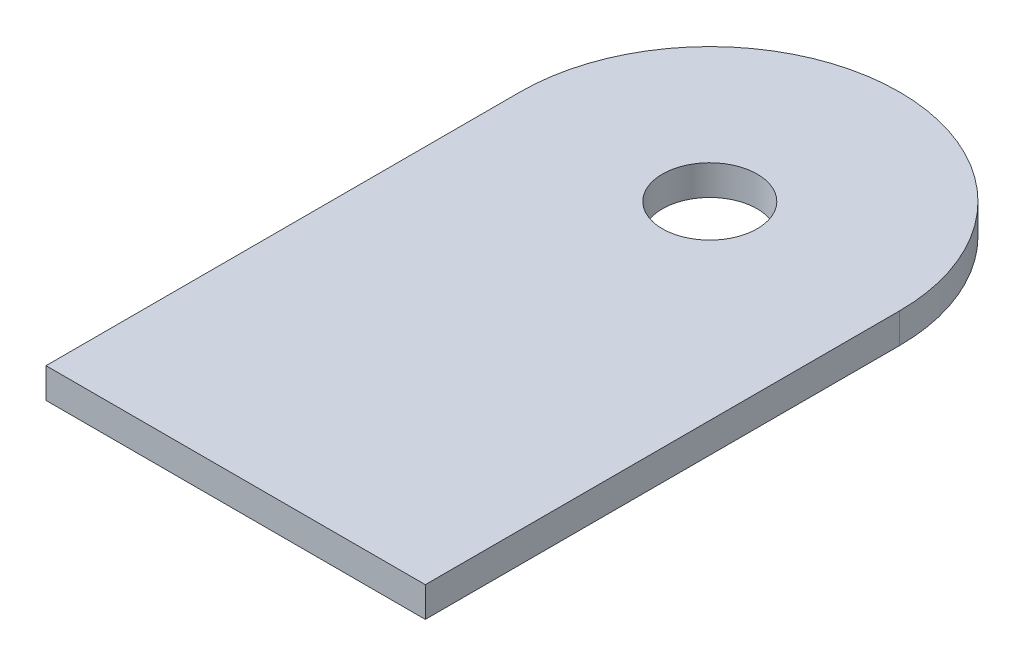
ISO-10303-21;
HEADER;
FILE_DESCRIPTION(('STEP AP214'),'2;1');
FILE_NAME('part.step','',(''),(''),'','','');
FILE_SCHEMA(('AUTOMOTIVE_DESIGN { 1 0 10303 214 1 1 1 1 }'));
ENDSEC;
DATA;
#1=APPLICATION_CONTEXT('core data for automotive mechanical design processes');
#2=APPLICATION_PROTOCOL_DEFINITION('international standard','automotive_design',2000,#1);
#3=PRODUCT_CONTEXT('',#1,'mechanical');
#4=PRODUCT('Part','Part','',(#3));
#5=PRODUCT_RELATED_PRODUCT_CATEGORY('part','',(#4));
#6=PRODUCT_DEFINITION_FORMATION('','',#4);
#7=PRODUCT_DEFINITION_CONTEXT('part definition',#1,'design');
#8=PRODUCT_DEFINITION('design','',#6,#7);
#9=PRODUCT_DEFINITION_SHAPE('','',#8);
#10=(LENGTH_UNIT() NAMED_UNIT(*) SI_UNIT(.MILLI.,.METRE.));
#11=(NAMED_UNIT(*) PLANE_ANGLE_UNIT() SI_UNIT($,.RADIAN.));
#12=(NAMED_UNIT(*) SI_UNIT($,.STERADIAN.) SOLID_ANGLE_UNIT());
#13=UNCERTAINTY_MEASURE_WITH_UNIT(LENGTH_MEASURE(1.E-05),#10,'distance_accuracy_value','');
#14=(GEOMETRIC_REPRESENTATION_CONTEXT(3) GLOBAL_UNCERTAINTY_ASSIGNED_CONTEXT((#13)) GLOBAL_UNIT_ASSIGNED_CONTEXT((#10,
#11,#12)) REPRESENTATION_CONTEXT('',''));
#15=CARTESIAN_POINT('',(0.,0.,0.));
#16=DIRECTION('',(0.,0.,1.));
#17=DIRECTION('',(1.,0.,0.));
#18=AXIS2_PLACEMENT_3D('',#15,#16,#17);
#19=CARTESIAN_POINT('',(0.,1.5875,0.));
#20=DIRECTION('',(0.,-1.,0.));
#21=DIRECTION('',(0.,0.,-1.));
#22=AXIS2_PLACEMENT_3D('',#19,#20,#21);
#23=PLANE('',#22);
#24=CARTESIAN_POINT('',(0.,1.5875,0.));
#25=DIRECTION('',(0.,1.,0.));
#26=DIRECTION('',(0.,0.,-1.));
#27=AXIS2_PLACEMENT_3D('',#24,#25,#26);
#28=CIRCLE('',#27,10.);
#29=CARTESIAN_POINT('',(10.,1.5875,0.));
#30=VERTEX_POINT('',#29);
#31=CARTESIAN_POINT('',(-10.,1.5875,0.));
#32=VERTEX_POINT('',#31);
#33=EDGE_CURVE('E88',#30,#32,#28,.T.);
#34=ORIENTED_EDGE('',*,*,#33,.T.);
#35=DIRECTION('',(0.,0.,1.));
#36=VECTOR('',#35,1.);
#37=CARTESIAN_POINT('',(-10.,1.5875,25.));
#38=LINE('',#37,#36);
#39=CARTESIAN_POINT('',(-10.,1.5875,25.));
#40=VERTEX_POINT('',#39);
#41=EDGE_CURVE('E83',#32,#40,#38,.T.);
#42=ORIENTED_EDGE('',*,*,#41,.T.);
#43=DIRECTION('',(1.,0.,0.));
#44=VECTOR('',#43,1.);
#45=CARTESIAN_POINT('',(10.,1.5875,25.));
#46=LINE('',#45,#44);
#47=CARTESIAN_POINT('',(10.,1.5875,25.));
#48=VERTEX_POINT('',#47);
#49=EDGE_CURVE('E86',#40,#48,#46,.T.);
#50=ORIENTED_EDGE('',*,*,#49,.T.);
#51=DIRECTION('',(0.,0.,-1.));
#52=VECTOR('',#51,1.);
#53=CARTESIAN_POINT('',(10.,1.5875,0.));
#54=LINE('',#53,#52);
#55=EDGE_CURVE('E53',#48,#30,#54,.T.);
#56=ORIENTED_EDGE('',*,*,#55,.T.);
#57=EDGE_LOOP('',(#34,#42,#50,#56));
#58=FACE_BOUND('',#57,.T.);
#59=CARTESIAN_POINT('',(0.,1.5875,0.));
#60=DIRECTION('',(0.,1.,0.));
#61=DIRECTION('',(0.,0.,1.));
#62=AXIS2_PLACEMENT_3D('',#59,#60,#61);
#63=CIRCLE('',#62,2.5);
#64=CARTESIAN_POINT('',(0.,1.5875,2.5));
#65=VERTEX_POINT('',#64);
#66=EDGE_CURVE('E103',#65,#65,#63,.T.);
#67=ORIENTED_EDGE('',*,*,#66,.F.);
#68=EDGE_LOOP('',(#67));
#69=FACE_BOUND('',#68,.T.);
#70=ADVANCED_FACE('F36',(#58,#69),#23,.F.);
#71=CARTESIAN_POINT('',(0.,0.,0.));
#72=DIRECTION('',(0.,-1.,0.));
#73=DIRECTION('',(0.,0.,-1.));
#74=AXIS2_PLACEMENT_3D('',#71,#72,#73);
#75=PLANE('',#74);
#76=CARTESIAN_POINT('',(0.,0.,0.));
#77=DIRECTION('',(0.,1.,0.));
#78=DIRECTION('',(0.,0.,-1.));
#79=AXIS2_PLACEMENT_3D('',#76,#77,#78);
#80=CIRCLE('',#79,10.);
#81=CARTESIAN_POINT('',(10.,0.,0.));
#82=VERTEX_POINT('',#81);
#83=CARTESIAN_POINT('',(-10.,0.,0.));
#84=VERTEX_POINT('',#83);
#85=EDGE_CURVE('E100',#82,#84,#80,.T.);
#86=ORIENTED_EDGE('',*,*,#85,.F.);
#87=DIRECTION('',(0.,0.,-1.));
#88=VECTOR('',#87,1.);
#89=CARTESIAN_POINT('',(10.,0.,0.));
#90=LINE('',#89,#88);
#91=CARTESIAN_POINT('',(10.,0.,25.));
#92=VERTEX_POINT('',#91);
#93=EDGE_CURVE('E76',#92,#82,#90,.T.);
#94=ORIENTED_EDGE('',*,*,#93,.F.);
#95=DIRECTION('',(1.,0.,0.));
#96=VECTOR('',#95,1.);
#97=CARTESIAN_POINT('',(10.,0.,25.));
#98=LINE('',#97,#96);
#99=CARTESIAN_POINT('',(-10.,0.,25.));
#100=VERTEX_POINT('',#99);
#101=EDGE_CURVE('E70',#100,#92,#98,.T.);
#102=ORIENTED_EDGE('',*,*,#101,.F.);
#103=DIRECTION('',(0.,0.,1.));
#104=VECTOR('',#103,1.);
#105=CARTESIAN_POINT('',(-10.,0.,25.));
#106=LINE('',#105,#104);
#107=EDGE_CURVE('E92',#84,#100,#106,.T.);
#108=ORIENTED_EDGE('',*,*,#107,.F.);
#109=EDGE_LOOP('',(#86,#94,#102,#108));
#110=FACE_BOUND('',#109,.T.);
#111=CARTESIAN_POINT('',(0.,0.,0.));
#112=DIRECTION('',(0.,1.,0.));
#113=DIRECTION('',(0.,0.,1.));
#114=AXIS2_PLACEMENT_3D('',#111,#112,#113);
#115=CIRCLE('',#114,2.5);
#116=CARTESIAN_POINT('',(0.,0.,2.5));
#117=VERTEX_POINT('',#116);
#118=EDGE_CURVE('E115',#117,#117,#115,.T.);
#119=ORIENTED_EDGE('',*,*,#118,.T.);
#120=EDGE_LOOP('',(#119));
#121=FACE_BOUND('',#120,.T.);
#122=ADVANCED_FACE('F111',(#110,#121),#75,.T.);
#123=CARTESIAN_POINT('',(0.,1.5875,0.));
#124=DIRECTION('',(0.,-1.,0.));
#125=DIRECTION('',(0.,0.,-1.));
#126=AXIS2_PLACEMENT_3D('',#123,#124,#125);
#127=CYLINDRICAL_SURFACE('',#126,10.);
#128=ORIENTED_EDGE('',*,*,#85,.T.);
#129=DIRECTION('',(0.,-1.,0.));
#130=VECTOR('',#129,1.);
#131=CARTESIAN_POINT('',(-10.,1.5875,0.));
#132=LINE('',#131,#130);
#133=EDGE_CURVE('E11',#32,#84,#132,.T.);
#134=ORIENTED_EDGE('',*,*,#133,.F.);
#135=ORIENTED_EDGE('',*,*,#33,.F.);
#136=DIRECTION('',(0.,-1.,0.));
#137=VECTOR('',#136,1.);
#138=CARTESIAN_POINT('',(10.,1.5875,0.));
#139=LINE('',#138,#137);
#140=EDGE_CURVE('E96',#30,#82,#139,.T.);
#141=ORIENTED_EDGE('',*,*,#140,.T.);
#142=EDGE_LOOP('',(#128,#134,#135,#141));
#143=FACE_BOUND('',#142,.T.);
#144=ADVANCED_FACE('F38',(#143),#127,.T.);
#145=CARTESIAN_POINT('',(-10.,1.5875,25.));
#146=DIRECTION('',(1.,0.,0.));
#147=DIRECTION('',(0.,0.,-1.));
#148=AXIS2_PLACEMENT_3D('',#145,#146,#147);
#149=PLANE('',#148);
#150=ORIENTED_EDGE('',*,*,#107,.T.);
#151=DIRECTION('',(0.,-1.,0.));
#152=VECTOR('',#151,1.);
#153=CARTESIAN_POINT('',(-10.,1.5875,25.));
#154=LINE('',#153,#152);
#155=EDGE_CURVE('E45',#40,#100,#154,.T.);
#156=ORIENTED_EDGE('',*,*,#155,.F.);
#157=ORIENTED_EDGE('',*,*,#41,.F.);
#158=ORIENTED_EDGE('',*,*,#133,.T.);
#159=EDGE_LOOP('',(#150,#156,#157,#158));
#160=FACE_BOUND('',#159,.T.);
#161=ADVANCED_FACE('F91',(#160),#149,.F.);
#162=CARTESIAN_POINT('',(10.,1.5875,25.));
#163=DIRECTION('',(0.,0.,-1.));
#164=DIRECTION('',(-1.,0.,0.));
#165=AXIS2_PLACEMENT_3D('',#162,#163,#164);
#166=PLANE('',#165);
#167=ORIENTED_EDGE('',*,*,#101,.T.);
#168=DIRECTION('',(0.,-1.,0.));
#169=VECTOR('',#168,1.);
#170=CARTESIAN_POINT('',(10.,1.5875,25.));
#171=LINE('',#170,#169);
#172=EDGE_CURVE('E93',#48,#92,#171,.T.);
#173=ORIENTED_EDGE('',*,*,#172,.F.);
#174=ORIENTED_EDGE('',*,*,#49,.F.);
#175=ORIENTED_EDGE('',*,*,#155,.T.);
#176=EDGE_LOOP('',(#167,#173,#174,#175));
#177=FACE_BOUND('',#176,.T.);
#178=ADVANCED_FACE('F94',(#177),#166,.F.);
#179=CARTESIAN_POINT('',(10.,1.5875,0.));
#180=DIRECTION('',(-1.,0.,0.));
#181=DIRECTION('',(0.,0.,1.));
#182=AXIS2_PLACEMENT_3D('',#179,#180,#181);
#183=PLANE('',#182);
#184=ORIENTED_EDGE('',*,*,#93,.T.);
#185=ORIENTED_EDGE('',*,*,#140,.F.);
#186=ORIENTED_EDGE('',*,*,#55,.F.);
#187=ORIENTED_EDGE('',*,*,#172,.T.);
#188=EDGE_LOOP('',(#184,#185,#186,#187));
#189=FACE_BOUND('',#188,.T.);
#190=ADVANCED_FACE('F108',(#189),#183,.F.);
#191=CARTESIAN_POINT('',(0.,1.5875,0.));
#192=DIRECTION('',(0.,-1.,0.));
#193=DIRECTION('',(0.,0.,-1.));
#194=AXIS2_PLACEMENT_3D('',#191,#192,#193);
#195=CYLINDRICAL_SURFACE('',#194,2.5);
#196=ORIENTED_EDGE('',*,*,#66,.T.);
#197=EDGE_LOOP('',(#196));
#198=FACE_BOUND('',#197,.T.);
#199=ORIENTED_EDGE('',*,*,#118,.F.);
#200=EDGE_LOOP('',(#199));
#201=FACE_BOUND('',#200,.T.);
#202=ADVANCED_FACE('F121',(#198,#201),#195,.F.);
#203=CLOSED_SHELL('',(#70,#122,#144,#161,#178,#190,#202));
#204=MANIFOLD_SOLID_BREP('B2',#203);
#205=ADVANCED_BREP_SHAPE_REPRESENTATION('',(#18,#204),#14);
#206=SHAPE_DEFINITION_REPRESENTATION(#9,#205);
ENDSEC;
END-ISO-10303-21;
